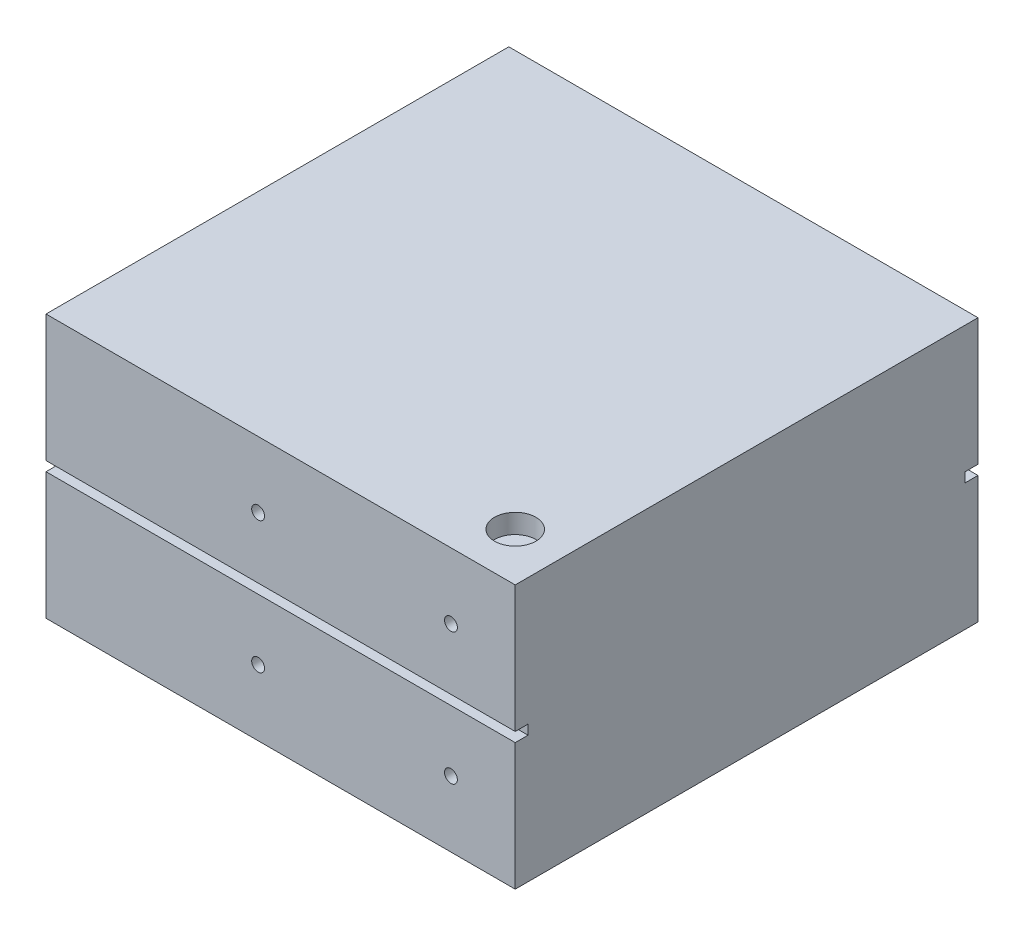
ISO-10303-21;
HEADER;
FILE_DESCRIPTION(('STEP AP214'),'2;1');
FILE_NAME('part.step','',(''),(''),'','','');
FILE_SCHEMA(('AUTOMOTIVE_DESIGN { 1 0 10303 214 1 1 1 1 }'));
ENDSEC;
DATA;
#1=APPLICATION_CONTEXT('core data for automotive mechanical design processes');
#2=APPLICATION_PROTOCOL_DEFINITION('international standard','automotive_design',2000,#1);
#3=PRODUCT_CONTEXT('',#1,'mechanical');
#4=PRODUCT('Part','Part','',(#3));
#5=PRODUCT_RELATED_PRODUCT_CATEGORY('part','',(#4));
#6=PRODUCT_DEFINITION_FORMATION('','',#4);
#7=PRODUCT_DEFINITION_CONTEXT('part definition',#1,'design');
#8=PRODUCT_DEFINITION('design','',#6,#7);
#9=PRODUCT_DEFINITION_SHAPE('','',#8);
#10=(LENGTH_UNIT() NAMED_UNIT(*) SI_UNIT(.MILLI.,.METRE.));
#11=(NAMED_UNIT(*) PLANE_ANGLE_UNIT() SI_UNIT($,.RADIAN.));
#12=(NAMED_UNIT(*) SI_UNIT($,.STERADIAN.) SOLID_ANGLE_UNIT());
#13=UNCERTAINTY_MEASURE_WITH_UNIT(LENGTH_MEASURE(1.E-05),#10,'distance_accuracy_value','');
#14=(GEOMETRIC_REPRESENTATION_CONTEXT(3) GLOBAL_UNCERTAINTY_ASSIGNED_CONTEXT((#13)) GLOBAL_UNIT_ASSIGNED_CONTEXT((#10,
#11,#12)) REPRESENTATION_CONTEXT('',''));
#15=CARTESIAN_POINT('',(0.,0.,0.));
#16=DIRECTION('',(0.,0.,1.));
#17=DIRECTION('',(1.,0.,0.));
#18=AXIS2_PLACEMENT_3D('',#15,#16,#17);
#19=CARTESIAN_POINT('',(-56.6030769230769,82.,107.163076923077));
#20=DIRECTION('',(0.,0.,-1.));
#21=DIRECTION('',(-1.,0.,0.));
#22=AXIS2_PLACEMENT_3D('',#19,#20,#21);
#23=PLANE('',#22);
#24=CARTESIAN_POINT('',(69.3969230769231,20.5,107.163076923077));
#25=DIRECTION('',(0.,0.,1.));
#26=DIRECTION('',(1.,0.,0.));
#27=AXIS2_PLACEMENT_3D('',#24,#25,#26);
#28=CIRCLE('',#27,2.);
#29=CARTESIAN_POINT('',(71.3969230769231,20.5,107.163076923077));
#30=VERTEX_POINT('',#29);
#31=EDGE_CURVE('E446',#30,#30,#28,.T.);
#32=ORIENTED_EDGE('',*,*,#31,.F.);
#33=EDGE_LOOP('',(#32));
#34=FACE_BOUND('',#33,.T.);
#35=CARTESIAN_POINT('',(9.39692307692308,20.5,107.163076923077));
#36=DIRECTION('',(0.,0.,1.));
#37=DIRECTION('',(1.,0.,0.));
#38=AXIS2_PLACEMENT_3D('',#35,#36,#37);
#39=CIRCLE('',#38,2.);
#40=CARTESIAN_POINT('',(11.3969230769231,20.5,107.163076923077));
#41=VERTEX_POINT('',#40);
#42=EDGE_CURVE('E458',#41,#41,#39,.T.);
#43=ORIENTED_EDGE('',*,*,#42,.F.);
#44=EDGE_LOOP('',(#43));
#45=FACE_BOUND('',#44,.T.);
#46=DIRECTION('',(0.,-1.,0.));
#47=VECTOR('',#46,1.);
#48=CARTESIAN_POINT('',(89.3969230769231,82.,107.163076923077));
#49=LINE('',#48,#47);
#50=CARTESIAN_POINT('',(89.3969230769231,39.5,107.163076923077));
#51=VERTEX_POINT('',#50);
#52=CARTESIAN_POINT('',(89.3969230769231,0.,107.163076923077));
#53=VERTEX_POINT('',#52);
#54=EDGE_CURVE('E251',#51,#53,#49,.T.);
#55=ORIENTED_EDGE('',*,*,#54,.F.);
#56=DIRECTION('',(-1.,0.,0.));
#57=VECTOR('',#56,1.);
#58=CARTESIAN_POINT('',(89.3969230769231,39.5,107.163076923077));
#59=LINE('',#58,#57);
#60=CARTESIAN_POINT('',(-56.6030769230769,39.5,107.163076923077));
#61=VERTEX_POINT('',#60);
#62=EDGE_CURVE('E178',#51,#61,#59,.T.);
#63=ORIENTED_EDGE('',*,*,#62,.T.);
#64=DIRECTION('',(0.,-1.,0.));
#65=VECTOR('',#64,1.);
#66=CARTESIAN_POINT('',(-56.6030769230769,82.,107.163076923077));
#67=LINE('',#66,#65);
#68=CARTESIAN_POINT('',(-56.6030769230769,0.,107.163076923077));
#69=VERTEX_POINT('',#68);
#70=EDGE_CURVE('E255',#61,#69,#67,.T.);
#71=ORIENTED_EDGE('',*,*,#70,.T.);
#72=DIRECTION('',(1.,0.,0.));
#73=VECTOR('',#72,1.);
#74=CARTESIAN_POINT('',(-56.6030769230769,0.,107.163076923077));
#75=LINE('',#74,#73);
#76=EDGE_CURVE('E238',#69,#53,#75,.T.);
#77=ORIENTED_EDGE('',*,*,#76,.T.);
#78=EDGE_LOOP('',(#55,#63,#71,#77));
#79=FACE_BOUND('',#78,.T.);
#80=ADVANCED_FACE('F33',(#34,#45,#79),#23,.F.);
#81=CARTESIAN_POINT('',(-56.6030769230769,82.,-36.8369230769231));
#82=DIRECTION('',(0.,0.,1.));
#83=DIRECTION('',(1.,0.,0.));
#84=AXIS2_PLACEMENT_3D('',#81,#82,#83);
#85=PLANE('',#84);
#86=CARTESIAN_POINT('',(69.3969230769231,61.5,-36.8369230769231));
#87=DIRECTION('',(0.,0.,-1.));
#88=DIRECTION('',(-1.,0.,0.));
#89=AXIS2_PLACEMENT_3D('',#86,#87,#88);
#90=CIRCLE('',#89,2.);
#91=CARTESIAN_POINT('',(67.3969230769231,61.5,-36.8369230769231));
#92=VERTEX_POINT('',#91);
#93=EDGE_CURVE('E436',#92,#92,#90,.T.);
#94=ORIENTED_EDGE('',*,*,#93,.F.);
#95=EDGE_LOOP('',(#94));
#96=FACE_BOUND('',#95,.T.);
#97=CARTESIAN_POINT('',(9.39692307692308,61.5,-36.8369230769231));
#98=DIRECTION('',(0.,0.,-1.));
#99=DIRECTION('',(-1.,0.,0.));
#100=AXIS2_PLACEMENT_3D('',#97,#98,#99);
#101=CIRCLE('',#100,2.);
#102=CARTESIAN_POINT('',(7.39692307692308,61.5,-36.8369230769231));
#103=VERTEX_POINT('',#102);
#104=EDGE_CURVE('E447',#103,#103,#101,.T.);
#105=ORIENTED_EDGE('',*,*,#104,.F.);
#106=EDGE_LOOP('',(#105));
#107=FACE_BOUND('',#106,.T.);
#108=DIRECTION('',(0.,-1.,0.));
#109=VECTOR('',#108,1.);
#110=CARTESIAN_POINT('',(89.3969230769231,82.,-36.8369230769231));
#111=LINE('',#110,#109);
#112=CARTESIAN_POINT('',(89.3969230769231,82.,-36.8369230769231));
#113=VERTEX_POINT('',#112);
#114=CARTESIAN_POINT('',(89.3969230769231,42.5,-36.8369230769231));
#115=VERTEX_POINT('',#114);
#116=EDGE_CURVE('E248',#113,#115,#111,.T.);
#117=ORIENTED_EDGE('',*,*,#116,.T.);
#118=DIRECTION('',(-1.,0.,0.));
#119=VECTOR('',#118,1.);
#120=CARTESIAN_POINT('',(89.3969230769231,42.5,-36.8369230769231));
#121=LINE('',#120,#119);
#122=CARTESIAN_POINT('',(-56.6030769230769,42.5,-36.8369230769231));
#123=VERTEX_POINT('',#122);
#124=EDGE_CURVE('E180',#115,#123,#121,.T.);
#125=ORIENTED_EDGE('',*,*,#124,.T.);
#126=DIRECTION('',(0.,-1.,0.));
#127=VECTOR('',#126,1.);
#128=CARTESIAN_POINT('',(-56.6030769230769,82.,-36.8369230769231));
#129=LINE('',#128,#127);
#130=CARTESIAN_POINT('',(-56.6030769230769,82.,-36.8369230769231));
#131=VERTEX_POINT('',#130);
#132=EDGE_CURVE('E245',#131,#123,#129,.T.);
#133=ORIENTED_EDGE('',*,*,#132,.F.);
#134=DIRECTION('',(-1.,0.,0.));
#135=VECTOR('',#134,1.);
#136=CARTESIAN_POINT('',(-56.6030769230769,82.,-36.8369230769231));
#137=LINE('',#136,#135);
#138=EDGE_CURVE('E232',#113,#131,#137,.T.);
#139=ORIENTED_EDGE('',*,*,#138,.F.);
#140=EDGE_LOOP('',(#117,#125,#133,#139));
#141=FACE_BOUND('',#140,.T.);
#142=ADVANCED_FACE('F315',(#96,#107,#141),#85,.F.);
#143=CARTESIAN_POINT('',(-50.6030769230769,82.,-36.8369230769231));
#144=DIRECTION('',(1.,0.,0.));
#145=DIRECTION('',(0.,0.,-1.));
#146=AXIS2_PLACEMENT_3D('',#143,#144,#145);
#147=PLANE('',#146);
#148=DIRECTION('',(0.,0.,1.));
#149=VECTOR('',#148,1.);
#150=CARTESIAN_POINT('',(-50.6030769230769,6.00000000000001,-36.8369230769231));
#151=LINE('',#150,#149);
#152=CARTESIAN_POINT('',(-50.6030769230769,6.,-30.8369230769231));
#153=VERTEX_POINT('',#152);
#154=CARTESIAN_POINT('',(-50.6030769230769,6.,101.163076923077));
#155=VERTEX_POINT('',#154);
#156=EDGE_CURVE('E258',#153,#155,#151,.T.);
#157=ORIENTED_EDGE('',*,*,#156,.F.);
#158=DIRECTION('',(0.,-1.,0.));
#159=VECTOR('',#158,1.);
#160=CARTESIAN_POINT('',(-50.6030769230769,82.,-30.8369230769231));
#161=LINE('',#160,#159);
#162=CARTESIAN_POINT('',(-50.6030769230769,76.,-30.8369230769231));
#163=VERTEX_POINT('',#162);
#164=EDGE_CURVE('E281',#163,#153,#161,.T.);
#165=ORIENTED_EDGE('',*,*,#164,.F.);
#166=DIRECTION('',(0.,0.,1.));
#167=VECTOR('',#166,1.);
#168=CARTESIAN_POINT('',(-50.6030769230769,76.,-36.8369230769231));
#169=LINE('',#168,#167);
#170=CARTESIAN_POINT('',(-50.6030769230769,76.,101.163076923077));
#171=VERTEX_POINT('',#170);
#172=EDGE_CURVE('E263',#163,#171,#169,.T.);
#173=ORIENTED_EDGE('',*,*,#172,.T.);
#174=DIRECTION('',(0.,-1.,0.));
#175=VECTOR('',#174,1.);
#176=CARTESIAN_POINT('',(-50.6030769230769,82.,101.163076923077));
#177=LINE('',#176,#175);
#178=EDGE_CURVE('E276',#171,#155,#177,.T.);
#179=ORIENTED_EDGE('',*,*,#178,.T.);
#180=EDGE_LOOP('',(#157,#165,#173,#179));
#181=FACE_BOUND('',#180,.T.);
#182=ADVANCED_FACE('F289',(#181),#147,.T.);
#183=CARTESIAN_POINT('',(-56.6030769230769,82.,101.163076923077));
#184=DIRECTION('',(0.,0.,-1.));
#185=DIRECTION('',(-1.,0.,0.));
#186=AXIS2_PLACEMENT_3D('',#183,#184,#185);
#187=PLANE('',#186);
#188=DIRECTION('',(1.,0.,0.));
#189=VECTOR('',#188,1.);
#190=CARTESIAN_POINT('',(-56.6030769230769,6.00000000000001,101.163076923077));
#191=LINE('',#190,#189);
#192=CARTESIAN_POINT('',(83.3969230769231,6.,101.163076923077));
#193=VERTEX_POINT('',#192);
#194=EDGE_CURVE('E279',#155,#193,#191,.T.);
#195=ORIENTED_EDGE('',*,*,#194,.F.);
#196=ORIENTED_EDGE('',*,*,#178,.F.);
#197=DIRECTION('',(1.,0.,0.));
#198=VECTOR('',#197,1.);
#199=CARTESIAN_POINT('',(-56.6030769230769,76.,101.163076923077));
#200=LINE('',#199,#198);
#201=CARTESIAN_POINT('',(83.3969230769231,76.,101.163076923077));
#202=VERTEX_POINT('',#201);
#203=EDGE_CURVE('E261',#171,#202,#200,.T.);
#204=ORIENTED_EDGE('',*,*,#203,.T.);
#205=DIRECTION('',(0.,-1.,0.));
#206=VECTOR('',#205,1.);
#207=CARTESIAN_POINT('',(83.3969230769231,82.,101.163076923077));
#208=LINE('',#207,#206);
#209=EDGE_CURVE('E271',#202,#193,#208,.T.);
#210=ORIENTED_EDGE('',*,*,#209,.T.);
#211=EDGE_LOOP('',(#195,#196,#204,#210));
#212=FACE_BOUND('',#211,.T.);
#213=ADVANCED_FACE('F293',(#212),#187,.T.);
#214=CARTESIAN_POINT('',(83.396923076923,82.,-36.8369230769231));
#215=DIRECTION('',(-1.,0.,0.));
#216=DIRECTION('',(0.,0.,1.));
#217=AXIS2_PLACEMENT_3D('',#214,#215,#216);
#218=PLANE('',#217);
#219=DIRECTION('',(0.,0.,-1.));
#220=VECTOR('',#219,1.);
#221=CARTESIAN_POINT('',(83.396923076923,6.00000000000001,-36.8369230769231));
#222=LINE('',#221,#220);
#223=CARTESIAN_POINT('',(83.396923076923,6.,-30.8369230769231));
#224=VERTEX_POINT('',#223);
#225=EDGE_CURVE('E274',#193,#224,#222,.T.);
#226=ORIENTED_EDGE('',*,*,#225,.F.);
#227=ORIENTED_EDGE('',*,*,#209,.F.);
#228=DIRECTION('',(0.,0.,-1.));
#229=VECTOR('',#228,1.);
#230=CARTESIAN_POINT('',(83.396923076923,76.,-36.8369230769231));
#231=LINE('',#230,#229);
#232=CARTESIAN_POINT('',(83.396923076923,76.,-30.8369230769231));
#233=VERTEX_POINT('',#232);
#234=EDGE_CURVE('E42',#202,#233,#231,.T.);
#235=ORIENTED_EDGE('',*,*,#234,.T.);
#236=DIRECTION('',(0.,-1.,0.));
#237=VECTOR('',#236,1.);
#238=CARTESIAN_POINT('',(83.396923076923,82.,-30.8369230769231));
#239=LINE('',#238,#237);
#240=EDGE_CURVE('E266',#233,#224,#239,.T.);
#241=ORIENTED_EDGE('',*,*,#240,.T.);
#242=EDGE_LOOP('',(#226,#227,#235,#241));
#243=FACE_BOUND('',#242,.T.);
#244=ADVANCED_FACE('F298',(#243),#218,.T.);
#245=CARTESIAN_POINT('',(-56.6030769230769,82.,-30.8369230769231));
#246=DIRECTION('',(0.,0.,1.));
#247=DIRECTION('',(1.,0.,0.));
#248=AXIS2_PLACEMENT_3D('',#245,#246,#247);
#249=PLANE('',#248);
#250=DIRECTION('',(-1.,0.,0.));
#251=VECTOR('',#250,1.);
#252=CARTESIAN_POINT('',(-56.6030769230769,6.00000000000001,-30.8369230769231));
#253=LINE('',#252,#251);
#254=EDGE_CURVE('E269',#224,#153,#253,.T.);
#255=ORIENTED_EDGE('',*,*,#254,.F.);
#256=ORIENTED_EDGE('',*,*,#240,.F.);
#257=DIRECTION('',(-1.,0.,0.));
#258=VECTOR('',#257,1.);
#259=CARTESIAN_POINT('',(-56.6030769230769,76.,-30.8369230769231));
#260=LINE('',#259,#258);
#261=EDGE_CURVE('E11',#233,#163,#260,.T.);
#262=ORIENTED_EDGE('',*,*,#261,.T.);
#263=ORIENTED_EDGE('',*,*,#164,.T.);
#264=EDGE_LOOP('',(#255,#256,#262,#263));
#265=FACE_BOUND('',#264,.T.);
#266=ADVANCED_FACE('F302',(#265),#249,.T.);
#267=CARTESIAN_POINT('',(0.,76.,0.));
#268=DIRECTION('',(0.,1.,0.));
#269=DIRECTION('',(0.,0.,1.));
#270=AXIS2_PLACEMENT_3D('',#267,#268,#269);
#271=PLANE('',#270);
#272=CARTESIAN_POINT('',(74.3969230769231,76.,92.1630769230769));
#273=DIRECTION('',(0.,1.,0.));
#274=DIRECTION('',(0.,0.,1.));
#275=AXIS2_PLACEMENT_3D('',#272,#273,#274);
#276=CIRCLE('',#275,6.45);
#277=CARTESIAN_POINT('',(74.3969230769231,76.,98.6130769230769));
#278=VERTEX_POINT('',#277);
#279=EDGE_CURVE('E37',#278,#278,#276,.T.);
#280=ORIENTED_EDGE('',*,*,#279,.T.);
#281=EDGE_LOOP('',(#280));
#282=FACE_BOUND('',#281,.T.);
#283=ORIENTED_EDGE('',*,*,#172,.F.);
#284=ORIENTED_EDGE('',*,*,#261,.F.);
#285=ORIENTED_EDGE('',*,*,#234,.F.);
#286=ORIENTED_EDGE('',*,*,#203,.F.);
#287=EDGE_LOOP('',(#283,#284,#285,#286));
#288=FACE_BOUND('',#287,.T.);
#289=ADVANCED_FACE('F304',(#282,#288),#271,.F.);
#290=CARTESIAN_POINT('',(0.,6.,0.));
#291=DIRECTION('',(0.,1.,0.));
#292=DIRECTION('',(0.,0.,1.));
#293=AXIS2_PLACEMENT_3D('',#290,#291,#292);
#294=PLANE('',#293);
#295=ORIENTED_EDGE('',*,*,#156,.T.);
#296=ORIENTED_EDGE('',*,*,#194,.T.);
#297=ORIENTED_EDGE('',*,*,#225,.T.);
#298=ORIENTED_EDGE('',*,*,#254,.T.);
#299=EDGE_LOOP('',(#295,#296,#297,#298));
#300=FACE_BOUND('',#299,.T.);
#301=ADVANCED_FACE('F35',(#300),#294,.T.);
#302=CARTESIAN_POINT('',(74.3969230769231,72.,92.1630769230769));
#303=DIRECTION('',(0.,1.,0.));
#304=DIRECTION('',(0.,0.,1.));
#305=AXIS2_PLACEMENT_3D('',#302,#303,#304);
#306=CYLINDRICAL_SURFACE('',#305,6.45);
#307=CARTESIAN_POINT('',(74.3969230769231,82.,92.1630769230769));
#308=DIRECTION('',(0.,1.,0.));
#309=DIRECTION('',(0.,0.,1.));
#310=AXIS2_PLACEMENT_3D('',#307,#308,#309);
#311=CIRCLE('',#310,6.45);
#312=CARTESIAN_POINT('',(74.3969230769231,82.,98.6130769230769));
#313=VERTEX_POINT('',#312);
#314=EDGE_CURVE('E213',#313,#313,#311,.T.);
#315=ORIENTED_EDGE('',*,*,#314,.T.);
#316=EDGE_LOOP('',(#315));
#317=FACE_BOUND('',#316,.T.);
#318=ORIENTED_EDGE('',*,*,#279,.F.);
#319=EDGE_LOOP('',(#318));
#320=FACE_BOUND('',#319,.T.);
#321=ADVANCED_FACE('F311',(#317,#320),#306,.F.);
#322=CARTESIAN_POINT('',(-56.6030769230769,82.,-36.8369230769231));
#323=DIRECTION('',(1.,0.,0.));
#324=DIRECTION('',(0.,0.,-1.));
#325=AXIS2_PLACEMENT_3D('',#322,#323,#324);
#326=PLANE('',#325);
#327=CARTESIAN_POINT('',(-56.6030769230769,62.,87.1630769230769));
#328=DIRECTION('',(-1.,0.,0.));
#329=DIRECTION('',(0.,0.,1.));
#330=AXIS2_PLACEMENT_3D('',#327,#328,#329);
#331=CIRCLE('',#330,6.5);
#332=CARTESIAN_POINT('',(-56.6030769230769,62.,93.6630769230769));
#333=VERTEX_POINT('',#332);
#334=EDGE_CURVE('E214',#333,#333,#331,.T.);
#335=ORIENTED_EDGE('',*,*,#334,.F.);
#336=EDGE_LOOP('',(#335));
#337=FACE_BOUND('',#336,.T.);
#338=CARTESIAN_POINT('',(-56.6030769230769,20.,-16.8369230769231));
#339=DIRECTION('',(-1.,0.,0.));
#340=DIRECTION('',(0.,0.,1.));
#341=AXIS2_PLACEMENT_3D('',#338,#339,#340);
#342=CIRCLE('',#341,6.50000000000001);
#343=CARTESIAN_POINT('',(-56.6030769230769,20.,-10.3369230769231));
#344=VERTEX_POINT('',#343);
#345=EDGE_CURVE('E183',#344,#344,#342,.T.);
#346=ORIENTED_EDGE('',*,*,#345,.F.);
#347=EDGE_LOOP('',(#346));
#348=FACE_BOUND('',#347,.T.);
#349=ORIENTED_EDGE('',*,*,#132,.T.);
#350=DIRECTION('',(0.,0.,-1.));
#351=VECTOR('',#350,1.);
#352=CARTESIAN_POINT('',(-56.6030769230769,42.5,-36.8369230769231));
#353=LINE('',#352,#351);
#354=CARTESIAN_POINT('',(-56.6030769230769,42.5,-32.8369230769231));
#355=VERTEX_POINT('',#354);
#356=EDGE_CURVE('E168',#355,#123,#353,.T.);
#357=ORIENTED_EDGE('',*,*,#356,.F.);
#358=DIRECTION('',(0.,1.,0.));
#359=VECTOR('',#358,1.);
#360=CARTESIAN_POINT('',(-56.6030769230769,42.5,-32.8369230769231));
#361=LINE('',#360,#359);
#362=CARTESIAN_POINT('',(-56.6030769230769,39.5,-32.8369230769231));
#363=VERTEX_POINT('',#362);
#364=EDGE_CURVE('E170',#363,#355,#361,.T.);
#365=ORIENTED_EDGE('',*,*,#364,.F.);
#366=DIRECTION('',(0.,0.,1.));
#367=VECTOR('',#366,1.);
#368=CARTESIAN_POINT('',(-56.6030769230769,39.5,-36.8369230769231));
#369=LINE('',#368,#367);
#370=CARTESIAN_POINT('',(-56.6030769230769,39.5,-36.8369230769231));
#371=VERTEX_POINT('',#370);
#372=EDGE_CURVE('E149',#371,#363,#369,.T.);
#373=ORIENTED_EDGE('',*,*,#372,.F.);
#374=CARTESIAN_POINT('',(-56.6030769230769,0.,-36.8369230769231));
#375=VERTEX_POINT('',#374);
#376=EDGE_CURVE('E234',#371,#375,#129,.T.);
#377=ORIENTED_EDGE('',*,*,#376,.T.);
#378=DIRECTION('',(0.,0.,1.));
#379=VECTOR('',#378,1.);
#380=CARTESIAN_POINT('',(-56.6030769230769,0.,-36.8369230769231));
#381=LINE('',#380,#379);
#382=EDGE_CURVE('E235',#375,#69,#381,.T.);
#383=ORIENTED_EDGE('',*,*,#382,.T.);
#384=ORIENTED_EDGE('',*,*,#70,.F.);
#385=DIRECTION('',(0.,0.,1.));
#386=VECTOR('',#385,1.);
#387=CARTESIAN_POINT('',(-56.6030769230769,39.5,107.163076923077));
#388=LINE('',#387,#386);
#389=CARTESIAN_POINT('',(-56.6030769230769,39.5,103.163076923077));
#390=VERTEX_POINT('',#389);
#391=EDGE_CURVE('E189',#390,#61,#388,.T.);
#392=ORIENTED_EDGE('',*,*,#391,.F.);
#393=DIRECTION('',(0.,-1.,0.));
#394=VECTOR('',#393,1.);
#395=CARTESIAN_POINT('',(-56.6030769230769,42.5,103.163076923077));
#396=LINE('',#395,#394);
#397=CARTESIAN_POINT('',(-56.6030769230769,42.5,103.163076923077));
#398=VERTEX_POINT('',#397);
#399=EDGE_CURVE('E198',#398,#390,#396,.T.);
#400=ORIENTED_EDGE('',*,*,#399,.F.);
#401=DIRECTION('',(0.,0.,-1.));
#402=VECTOR('',#401,1.);
#403=CARTESIAN_POINT('',(-56.6030769230769,42.5,107.163076923077));
#404=LINE('',#403,#402);
#405=CARTESIAN_POINT('',(-56.6030769230769,42.5,107.163076923077));
#406=VERTEX_POINT('',#405);
#407=EDGE_CURVE('E195',#406,#398,#404,.T.);
#408=ORIENTED_EDGE('',*,*,#407,.F.);
#409=CARTESIAN_POINT('',(-56.6030769230769,82.,107.163076923077));
#410=VERTEX_POINT('',#409);
#411=EDGE_CURVE('E256',#410,#406,#67,.T.);
#412=ORIENTED_EDGE('',*,*,#411,.F.);
#413=DIRECTION('',(0.,0.,1.));
#414=VECTOR('',#413,1.);
#415=CARTESIAN_POINT('',(-56.6030769230769,82.,-36.8369230769231));
#416=LINE('',#415,#414);
#417=EDGE_CURVE('E224',#131,#410,#416,.T.);
#418=ORIENTED_EDGE('',*,*,#417,.F.);
#419=EDGE_LOOP('',(#349,#357,#365,#373,#377,#383,#384,#392,#400,#408,#412,#418));
#420=FACE_BOUND('',#419,.T.);
#421=ADVANCED_FACE('F330',(#337,#348,#420),#326,.F.);
#422=CARTESIAN_POINT('',(9.39692307692308,61.5,107.163076923077));
#423=DIRECTION('',(0.,0.,1.));
#424=DIRECTION('',(1.,0.,0.));
#425=AXIS2_PLACEMENT_3D('',#422,#423,#424);
#426=CIRCLE('',#425,2.);
#427=CARTESIAN_POINT('',(11.3969230769231,61.5,107.163076923077));
#428=VERTEX_POINT('',#427);
#429=EDGE_CURVE('E340',#428,#428,#426,.T.);
#430=ORIENTED_EDGE('',*,*,#429,.F.);
#431=EDGE_LOOP('',(#430));
#432=FACE_BOUND('',#431,.T.);
#433=CARTESIAN_POINT('',(69.3969230769231,61.5,107.163076923077));
#434=DIRECTION('',(0.,0.,1.));
#435=DIRECTION('',(1.,0.,0.));
#436=AXIS2_PLACEMENT_3D('',#433,#434,#435);
#437=CIRCLE('',#436,2.);
#438=CARTESIAN_POINT('',(71.3969230769231,61.5,107.163076923077));
#439=VERTEX_POINT('',#438);
#440=EDGE_CURVE('E173',#439,#439,#437,.T.);
#441=ORIENTED_EDGE('',*,*,#440,.F.);
#442=EDGE_LOOP('',(#441));
#443=FACE_BOUND('',#442,.T.);
#444=ORIENTED_EDGE('',*,*,#411,.T.);
#445=DIRECTION('',(-1.,0.,0.));
#446=VECTOR('',#445,1.);
#447=CARTESIAN_POINT('',(89.3969230769231,42.5,107.163076923077));
#448=LINE('',#447,#446);
#449=CARTESIAN_POINT('',(89.3969230769231,42.5,107.163076923077));
#450=VERTEX_POINT('',#449);
#451=EDGE_CURVE('E194',#450,#406,#448,.T.);
#452=ORIENTED_EDGE('',*,*,#451,.F.);
#453=CARTESIAN_POINT('',(89.3969230769231,82.,107.163076923077));
#454=VERTEX_POINT('',#453);
#455=EDGE_CURVE('E252',#454,#450,#49,.T.);
#456=ORIENTED_EDGE('',*,*,#455,.F.);
#457=DIRECTION('',(1.,0.,0.));
#458=VECTOR('',#457,1.);
#459=CARTESIAN_POINT('',(-56.6030769230769,82.,107.163076923077));
#460=LINE('',#459,#458);
#461=EDGE_CURVE('E227',#410,#454,#460,.T.);
#462=ORIENTED_EDGE('',*,*,#461,.F.);
#463=EDGE_LOOP('',(#444,#452,#456,#462));
#464=FACE_BOUND('',#463,.T.);
#465=ADVANCED_FACE('F318',(#432,#443,#464),#23,.F.);
#466=CARTESIAN_POINT('',(89.3969230769231,82.,-36.8369230769231));
#467=DIRECTION('',(-1.,0.,0.));
#468=DIRECTION('',(0.,0.,1.));
#469=AXIS2_PLACEMENT_3D('',#466,#467,#468);
#470=PLANE('',#469);
#471=DIRECTION('',(0.,1.,0.));
#472=VECTOR('',#471,1.);
#473=CARTESIAN_POINT('',(89.3969230769231,42.5,-32.8369230769231));
#474=LINE('',#473,#472);
#475=CARTESIAN_POINT('',(89.3969230769231,39.5,-32.8369230769231));
#476=VERTEX_POINT('',#475);
#477=CARTESIAN_POINT('',(89.3969230769231,42.5,-32.8369230769231));
#478=VERTEX_POINT('',#477);
#479=EDGE_CURVE('E157',#476,#478,#474,.T.);
#480=ORIENTED_EDGE('',*,*,#479,.T.);
#481=DIRECTION('',(0.,0.,-1.));
#482=VECTOR('',#481,1.);
#483=CARTESIAN_POINT('',(89.3969230769231,42.5,-36.8369230769231));
#484=LINE('',#483,#482);
#485=EDGE_CURVE('E162',#478,#115,#484,.T.);
#486=ORIENTED_EDGE('',*,*,#485,.T.);
#487=ORIENTED_EDGE('',*,*,#116,.F.);
#488=DIRECTION('',(0.,0.,-1.));
#489=VECTOR('',#488,1.);
#490=CARTESIAN_POINT('',(89.3969230769231,82.,-36.8369230769231));
#491=LINE('',#490,#489);
#492=EDGE_CURVE('E230',#454,#113,#491,.T.);
#493=ORIENTED_EDGE('',*,*,#492,.F.);
#494=ORIENTED_EDGE('',*,*,#455,.T.);
#495=DIRECTION('',(0.,0.,-1.));
#496=VECTOR('',#495,1.);
#497=CARTESIAN_POINT('',(89.3969230769231,42.5,107.163076923077));
#498=LINE('',#497,#496);
#499=CARTESIAN_POINT('',(89.3969230769231,42.5,103.163076923077));
#500=VERTEX_POINT('',#499);
#501=EDGE_CURVE('E186',#450,#500,#498,.T.);
#502=ORIENTED_EDGE('',*,*,#501,.T.);
#503=DIRECTION('',(0.,-1.,0.));
#504=VECTOR('',#503,1.);
#505=CARTESIAN_POINT('',(89.3969230769231,42.5,103.163076923077));
#506=LINE('',#505,#504);
#507=CARTESIAN_POINT('',(89.3969230769231,39.5,103.163076923077));
#508=VERTEX_POINT('',#507);
#509=EDGE_CURVE('E50',#500,#508,#506,.T.);
#510=ORIENTED_EDGE('',*,*,#509,.T.);
#511=DIRECTION('',(0.,0.,1.));
#512=VECTOR('',#511,1.);
#513=CARTESIAN_POINT('',(89.3969230769231,39.5,107.163076923077));
#514=LINE('',#513,#512);
#515=EDGE_CURVE('E191',#508,#51,#514,.T.);
#516=ORIENTED_EDGE('',*,*,#515,.T.);
#517=ORIENTED_EDGE('',*,*,#54,.T.);
#518=DIRECTION('',(0.,0.,-1.));
#519=VECTOR('',#518,1.);
#520=CARTESIAN_POINT('',(89.3969230769231,0.,-36.8369230769231));
#521=LINE('',#520,#519);
#522=CARTESIAN_POINT('',(89.3969230769231,0.,-36.8369230769231));
#523=VERTEX_POINT('',#522);
#524=EDGE_CURVE('E241',#53,#523,#521,.T.);
#525=ORIENTED_EDGE('',*,*,#524,.T.);
#526=CARTESIAN_POINT('',(89.3969230769231,39.5,-36.8369230769231));
#527=VERTEX_POINT('',#526);
#528=EDGE_CURVE('E167',#527,#523,#111,.T.);
#529=ORIENTED_EDGE('',*,*,#528,.F.);
#530=DIRECTION('',(0.,0.,1.));
#531=VECTOR('',#530,1.);
#532=CARTESIAN_POINT('',(89.3969230769231,39.5,-36.8369230769231));
#533=LINE('',#532,#531);
#534=EDGE_CURVE('E58',#527,#476,#533,.T.);
#535=ORIENTED_EDGE('',*,*,#534,.T.);
#536=EDGE_LOOP('',(#480,#486,#487,#493,#494,#502,#510,#516,#517,#525,#529,#535));
#537=FACE_BOUND('',#536,.T.);
#538=ADVANCED_FACE('F165',(#537),#470,.F.);
#539=CARTESIAN_POINT('',(9.39692307692308,20.5,-36.8369230769231));
#540=DIRECTION('',(0.,0.,-1.));
#541=DIRECTION('',(-1.,0.,0.));
#542=AXIS2_PLACEMENT_3D('',#539,#540,#541);
#543=CIRCLE('',#542,2.);
#544=CARTESIAN_POINT('',(7.39692307692308,20.5,-36.8369230769231));
#545=VERTEX_POINT('',#544);
#546=EDGE_CURVE('E417',#545,#545,#543,.T.);
#547=ORIENTED_EDGE('',*,*,#546,.F.);
#548=EDGE_LOOP('',(#547));
#549=FACE_BOUND('',#548,.T.);
#550=CARTESIAN_POINT('',(69.3969230769231,20.5,-36.8369230769231));
#551=DIRECTION('',(0.,0.,-1.));
#552=DIRECTION('',(-1.,0.,0.));
#553=AXIS2_PLACEMENT_3D('',#550,#551,#552);
#554=CIRCLE('',#553,2.);
#555=CARTESIAN_POINT('',(67.3969230769231,20.5,-36.8369230769231));
#556=VERTEX_POINT('',#555);
#557=EDGE_CURVE('E421',#556,#556,#554,.T.);
#558=ORIENTED_EDGE('',*,*,#557,.F.);
#559=EDGE_LOOP('',(#558));
#560=FACE_BOUND('',#559,.T.);
#561=ORIENTED_EDGE('',*,*,#376,.F.);
#562=DIRECTION('',(-1.,0.,0.));
#563=VECTOR('',#562,1.);
#564=CARTESIAN_POINT('',(89.3969230769231,39.5,-36.8369230769231));
#565=LINE('',#564,#563);
#566=EDGE_CURVE('E154',#527,#371,#565,.T.);
#567=ORIENTED_EDGE('',*,*,#566,.F.);
#568=ORIENTED_EDGE('',*,*,#528,.T.);
#569=DIRECTION('',(-1.,0.,0.));
#570=VECTOR('',#569,1.);
#571=CARTESIAN_POINT('',(-56.6030769230769,0.,-36.8369230769231));
#572=LINE('',#571,#570);
#573=EDGE_CURVE('E228',#523,#375,#572,.T.);
#574=ORIENTED_EDGE('',*,*,#573,.T.);
#575=EDGE_LOOP('',(#561,#567,#568,#574));
#576=FACE_BOUND('',#575,.T.);
#577=ADVANCED_FACE('F324',(#549,#560,#576),#85,.F.);
#578=CARTESIAN_POINT('',(0.,82.,0.));
#579=DIRECTION('',(0.,1.,0.));
#580=DIRECTION('',(0.,0.,1.));
#581=AXIS2_PLACEMENT_3D('',#578,#579,#580);
#582=PLANE('',#581);
#583=ORIENTED_EDGE('',*,*,#314,.F.);
#584=EDGE_LOOP('',(#583));
#585=FACE_BOUND('',#584,.T.);
#586=ORIENTED_EDGE('',*,*,#417,.T.);
#587=ORIENTED_EDGE('',*,*,#461,.T.);
#588=ORIENTED_EDGE('',*,*,#492,.T.);
#589=ORIENTED_EDGE('',*,*,#138,.T.);
#590=EDGE_LOOP('',(#586,#587,#588,#589));
#591=FACE_BOUND('',#590,.T.);
#592=ADVANCED_FACE('F358',(#585,#591),#582,.T.);
#593=CARTESIAN_POINT('',(0.,0.,0.));
#594=DIRECTION('',(0.,1.,0.));
#595=DIRECTION('',(0.,0.,1.));
#596=AXIS2_PLACEMENT_3D('',#593,#594,#595);
#597=PLANE('',#596);
#598=ORIENTED_EDGE('',*,*,#382,.F.);
#599=ORIENTED_EDGE('',*,*,#573,.F.);
#600=ORIENTED_EDGE('',*,*,#524,.F.);
#601=ORIENTED_EDGE('',*,*,#76,.F.);
#602=EDGE_LOOP('',(#598,#599,#600,#601));
#603=FACE_BOUND('',#602,.T.);
#604=ADVANCED_FACE('F400',(#603),#597,.F.);
#605=CARTESIAN_POINT('',(-51.6030769230769,20.,-16.8369230769231));
#606=DIRECTION('',(-1.,0.,0.));
#607=DIRECTION('',(0.,0.,1.));
#608=AXIS2_PLACEMENT_3D('',#605,#606,#607);
#609=CYLINDRICAL_SURFACE('',#608,6.50000000000001);
#610=CARTESIAN_POINT('',(-51.6030769230769,20.,-16.8369230769231));
#611=DIRECTION('',(-1.,0.,0.));
#612=DIRECTION('',(0.,0.,1.));
#613=AXIS2_PLACEMENT_3D('',#610,#611,#612);
#614=CIRCLE('',#613,6.50000000000001);
#615=CARTESIAN_POINT('',(-51.6030769230769,20.,-10.3369230769231));
#616=VERTEX_POINT('',#615);
#617=EDGE_CURVE('E217',#616,#616,#614,.T.);
#618=ORIENTED_EDGE('',*,*,#617,.F.);
#619=EDGE_LOOP('',(#618));
#620=FACE_BOUND('',#619,.T.);
#621=ORIENTED_EDGE('',*,*,#345,.T.);
#622=EDGE_LOOP('',(#621));
#623=FACE_BOUND('',#622,.T.);
#624=ADVANCED_FACE('F396',(#620,#623),#609,.F.);
#625=CARTESIAN_POINT('',(-51.6030769230769,20.,-16.8369230769231));
#626=DIRECTION('',(-1.,0.,0.));
#627=DIRECTION('',(0.,0.,1.));
#628=AXIS2_PLACEMENT_3D('',#625,#626,#627);
#629=PLANE('',#628);
#630=ORIENTED_EDGE('',*,*,#617,.T.);
#631=EDGE_LOOP('',(#630));
#632=FACE_BOUND('',#631,.T.);
#633=ADVANCED_FACE('F392',(#632),#629,.T.);
#634=CARTESIAN_POINT('',(-51.6030769230769,62.,87.1630769230769));
#635=DIRECTION('',(-1.,0.,0.));
#636=DIRECTION('',(0.,0.,1.));
#637=AXIS2_PLACEMENT_3D('',#634,#635,#636);
#638=CYLINDRICAL_SURFACE('',#637,6.5);
#639=CARTESIAN_POINT('',(-51.6030769230769,62.,87.1630769230769));
#640=DIRECTION('',(-1.,0.,0.));
#641=DIRECTION('',(0.,0.,1.));
#642=AXIS2_PLACEMENT_3D('',#639,#640,#641);
#643=CIRCLE('',#642,6.5);
#644=CARTESIAN_POINT('',(-51.6030769230769,62.,93.6630769230769));
#645=VERTEX_POINT('',#644);
#646=EDGE_CURVE('E210',#645,#645,#643,.T.);
#647=ORIENTED_EDGE('',*,*,#646,.F.);
#648=EDGE_LOOP('',(#647));
#649=FACE_BOUND('',#648,.T.);
#650=ORIENTED_EDGE('',*,*,#334,.T.);
#651=EDGE_LOOP('',(#650));
#652=FACE_BOUND('',#651,.T.);
#653=ADVANCED_FACE('F372',(#649,#652),#638,.F.);
#654=CARTESIAN_POINT('',(-51.6030769230769,62.,87.1630769230769));
#655=DIRECTION('',(-1.,0.,0.));
#656=DIRECTION('',(0.,0.,1.));
#657=AXIS2_PLACEMENT_3D('',#654,#655,#656);
#658=PLANE('',#657);
#659=ORIENTED_EDGE('',*,*,#646,.T.);
#660=EDGE_LOOP('',(#659));
#661=FACE_BOUND('',#660,.T.);
#662=ADVANCED_FACE('F365',(#661),#658,.T.);
#663=CARTESIAN_POINT('',(89.3969230769231,42.5,-36.8369230769231));
#664=DIRECTION('',(0.,1.,0.));
#665=DIRECTION('',(0.,0.,1.));
#666=AXIS2_PLACEMENT_3D('',#663,#664,#665);
#667=PLANE('',#666);
#668=ORIENTED_EDGE('',*,*,#356,.T.);
#669=ORIENTED_EDGE('',*,*,#124,.F.);
#670=ORIENTED_EDGE('',*,*,#485,.F.);
#671=DIRECTION('',(-1.,0.,0.));
#672=VECTOR('',#671,1.);
#673=CARTESIAN_POINT('',(89.3969230769231,42.5,-32.8369230769231));
#674=LINE('',#673,#672);
#675=EDGE_CURVE('E153',#478,#355,#674,.T.);
#676=ORIENTED_EDGE('',*,*,#675,.T.);
#677=EDGE_LOOP('',(#668,#669,#670,#676));
#678=FACE_BOUND('',#677,.T.);
#679=ADVANCED_FACE('F363',(#678),#667,.F.);
#680=CARTESIAN_POINT('',(89.3969230769231,42.5,-32.8369230769231));
#681=DIRECTION('',(0.,0.,1.));
#682=DIRECTION('',(1.,0.,0.));
#683=AXIS2_PLACEMENT_3D('',#680,#681,#682);
#684=PLANE('',#683);
#685=ORIENTED_EDGE('',*,*,#364,.T.);
#686=ORIENTED_EDGE('',*,*,#675,.F.);
#687=ORIENTED_EDGE('',*,*,#479,.F.);
#688=DIRECTION('',(-1.,0.,0.));
#689=VECTOR('',#688,1.);
#690=CARTESIAN_POINT('',(89.3969230769231,39.5,-32.8369230769231));
#691=LINE('',#690,#689);
#692=EDGE_CURVE('E145',#476,#363,#691,.T.);
#693=ORIENTED_EDGE('',*,*,#692,.T.);
#694=EDGE_LOOP('',(#685,#686,#687,#693));
#695=FACE_BOUND('',#694,.T.);
#696=ADVANCED_FACE('F158',(#695),#684,.F.);
#697=CARTESIAN_POINT('',(89.3969230769231,39.5,-36.8369230769231));
#698=DIRECTION('',(0.,-1.,0.));
#699=DIRECTION('',(0.,0.,-1.));
#700=AXIS2_PLACEMENT_3D('',#697,#698,#699);
#701=PLANE('',#700);
#702=ORIENTED_EDGE('',*,*,#372,.T.);
#703=ORIENTED_EDGE('',*,*,#692,.F.);
#704=ORIENTED_EDGE('',*,*,#534,.F.);
#705=ORIENTED_EDGE('',*,*,#566,.T.);
#706=EDGE_LOOP('',(#702,#703,#704,#705));
#707=FACE_BOUND('',#706,.T.);
#708=ADVANCED_FACE('F147',(#707),#701,.F.);
#709=CARTESIAN_POINT('',(89.3969230769231,39.5,107.163076923077));
#710=DIRECTION('',(0.,-1.,0.));
#711=DIRECTION('',(0.,0.,-1.));
#712=AXIS2_PLACEMENT_3D('',#709,#710,#711);
#713=PLANE('',#712);
#714=ORIENTED_EDGE('',*,*,#391,.T.);
#715=ORIENTED_EDGE('',*,*,#62,.F.);
#716=ORIENTED_EDGE('',*,*,#515,.F.);
#717=DIRECTION('',(-1.,0.,0.));
#718=VECTOR('',#717,1.);
#719=CARTESIAN_POINT('',(89.3969230769231,39.5,103.163076923077));
#720=LINE('',#719,#718);
#721=EDGE_CURVE('E205',#508,#390,#720,.T.);
#722=ORIENTED_EDGE('',*,*,#721,.T.);
#723=EDGE_LOOP('',(#714,#715,#716,#722));
#724=FACE_BOUND('',#723,.T.);
#725=ADVANCED_FACE('F381',(#724),#713,.F.);
#726=CARTESIAN_POINT('',(89.3969230769231,42.5,103.163076923077));
#727=DIRECTION('',(0.,0.,-1.));
#728=DIRECTION('',(-1.,0.,0.));
#729=AXIS2_PLACEMENT_3D('',#726,#727,#728);
#730=PLANE('',#729);
#731=ORIENTED_EDGE('',*,*,#399,.T.);
#732=ORIENTED_EDGE('',*,*,#721,.F.);
#733=ORIENTED_EDGE('',*,*,#509,.F.);
#734=DIRECTION('',(-1.,0.,0.));
#735=VECTOR('',#734,1.);
#736=CARTESIAN_POINT('',(89.3969230769231,42.5,103.163076923077));
#737=LINE('',#736,#735);
#738=EDGE_CURVE('E207',#500,#398,#737,.T.);
#739=ORIENTED_EDGE('',*,*,#738,.T.);
#740=EDGE_LOOP('',(#731,#732,#733,#739));
#741=FACE_BOUND('',#740,.T.);
#742=ADVANCED_FACE('F384',(#741),#730,.F.);
#743=CARTESIAN_POINT('',(89.3969230769231,42.5,107.163076923077));
#744=DIRECTION('',(0.,1.,0.));
#745=DIRECTION('',(0.,0.,1.));
#746=AXIS2_PLACEMENT_3D('',#743,#744,#745);
#747=PLANE('',#746);
#748=ORIENTED_EDGE('',*,*,#407,.T.);
#749=ORIENTED_EDGE('',*,*,#738,.F.);
#750=ORIENTED_EDGE('',*,*,#501,.F.);
#751=ORIENTED_EDGE('',*,*,#451,.T.);
#752=EDGE_LOOP('',(#748,#749,#750,#751));
#753=FACE_BOUND('',#752,.T.);
#754=ADVANCED_FACE('F353',(#753),#747,.F.);
#755=CARTESIAN_POINT('',(69.3969230769231,61.5,103.163076923077));
#756=DIRECTION('',(0.,0.,1.));
#757=DIRECTION('',(1.,0.,0.));
#758=AXIS2_PLACEMENT_3D('',#755,#756,#757);
#759=CYLINDRICAL_SURFACE('',#758,2.);
#760=CARTESIAN_POINT('',(69.3969230769231,61.5,103.163076923077));
#761=DIRECTION('',(0.,0.,1.));
#762=DIRECTION('',(1.,0.,0.));
#763=AXIS2_PLACEMENT_3D('',#760,#761,#762);
#764=CIRCLE('',#763,2.);
#765=CARTESIAN_POINT('',(71.3969230769231,61.5,103.163076923077));
#766=VERTEX_POINT('',#765);
#767=EDGE_CURVE('E199',#766,#766,#764,.T.);
#768=ORIENTED_EDGE('',*,*,#767,.F.);
#769=EDGE_LOOP('',(#768));
#770=FACE_BOUND('',#769,.T.);
#771=ORIENTED_EDGE('',*,*,#440,.T.);
#772=EDGE_LOOP('',(#771));
#773=FACE_BOUND('',#772,.T.);
#774=ADVANCED_FACE('F376',(#770,#773),#759,.F.);
#775=CARTESIAN_POINT('',(69.3969230769231,61.5,103.163076923077));
#776=DIRECTION('',(0.,0.,1.));
#777=DIRECTION('',(1.,0.,0.));
#778=AXIS2_PLACEMENT_3D('',#775,#776,#777);
#779=PLANE('',#778);
#780=ORIENTED_EDGE('',*,*,#767,.T.);
#781=EDGE_LOOP('',(#780));
#782=FACE_BOUND('',#781,.T.);
#783=ADVANCED_FACE('F470',(#782),#779,.T.);
#784=CARTESIAN_POINT('',(9.39692307692308,61.5,103.163076923077));
#785=DIRECTION('',(0.,0.,1.));
#786=DIRECTION('',(1.,0.,0.));
#787=AXIS2_PLACEMENT_3D('',#784,#785,#786);
#788=CYLINDRICAL_SURFACE('',#787,2.);
#789=CARTESIAN_POINT('',(9.39692307692308,61.5,103.163076923077));
#790=DIRECTION('',(0.,0.,1.));
#791=DIRECTION('',(1.,0.,0.));
#792=AXIS2_PLACEMENT_3D('',#789,#790,#791);
#793=CIRCLE('',#792,2.);
#794=CARTESIAN_POINT('',(11.3969230769231,61.5,103.163076923077));
#795=VERTEX_POINT('',#794);
#796=EDGE_CURVE('E451',#795,#795,#793,.T.);
#797=ORIENTED_EDGE('',*,*,#796,.F.);
#798=EDGE_LOOP('',(#797));
#799=FACE_BOUND('',#798,.T.);
#800=ORIENTED_EDGE('',*,*,#429,.T.);
#801=EDGE_LOOP('',(#800));
#802=FACE_BOUND('',#801,.T.);
#803=ADVANCED_FACE('F475',(#799,#802),#788,.F.);
#804=CARTESIAN_POINT('',(9.39692307692308,61.5,103.163076923077));
#805=DIRECTION('',(0.,0.,1.));
#806=DIRECTION('',(1.,0.,0.));
#807=AXIS2_PLACEMENT_3D('',#804,#805,#806);
#808=PLANE('',#807);
#809=ORIENTED_EDGE('',*,*,#796,.T.);
#810=EDGE_LOOP('',(#809));
#811=FACE_BOUND('',#810,.T.);
#812=ADVANCED_FACE('F479',(#811),#808,.T.);
#813=CARTESIAN_POINT('',(9.39692307692308,20.5,103.163076923077));
#814=DIRECTION('',(0.,0.,1.));
#815=DIRECTION('',(1.,0.,0.));
#816=AXIS2_PLACEMENT_3D('',#813,#814,#815);
#817=CYLINDRICAL_SURFACE('',#816,2.);
#818=CARTESIAN_POINT('',(9.39692307692308,20.5,103.163076923077));
#819=DIRECTION('',(0.,0.,1.));
#820=DIRECTION('',(1.,0.,0.));
#821=AXIS2_PLACEMENT_3D('',#818,#819,#820);
#822=CIRCLE('',#821,2.);
#823=CARTESIAN_POINT('',(11.3969230769231,20.5,103.163076923077));
#824=VERTEX_POINT('',#823);
#825=EDGE_CURVE('E455',#824,#824,#822,.T.);
#826=ORIENTED_EDGE('',*,*,#825,.F.);
#827=EDGE_LOOP('',(#826));
#828=FACE_BOUND('',#827,.T.);
#829=ORIENTED_EDGE('',*,*,#42,.T.);
#830=EDGE_LOOP('',(#829));
#831=FACE_BOUND('',#830,.T.);
#832=ADVANCED_FACE('F493',(#828,#831),#817,.F.);
#833=CARTESIAN_POINT('',(9.39692307692308,20.5,103.163076923077));
#834=DIRECTION('',(0.,0.,1.));
#835=DIRECTION('',(1.,0.,0.));
#836=AXIS2_PLACEMENT_3D('',#833,#834,#835);
#837=PLANE('',#836);
#838=ORIENTED_EDGE('',*,*,#825,.T.);
#839=EDGE_LOOP('',(#838));
#840=FACE_BOUND('',#839,.T.);
#841=ADVANCED_FACE('F487',(#840),#837,.T.);
#842=CARTESIAN_POINT('',(69.3969230769231,20.5,103.163076923077));
#843=DIRECTION('',(0.,0.,1.));
#844=DIRECTION('',(1.,0.,0.));
#845=AXIS2_PLACEMENT_3D('',#842,#843,#844);
#846=CYLINDRICAL_SURFACE('',#845,2.);
#847=CARTESIAN_POINT('',(69.3969230769231,20.5,103.163076923077));
#848=DIRECTION('',(0.,0.,1.));
#849=DIRECTION('',(1.,0.,0.));
#850=AXIS2_PLACEMENT_3D('',#847,#848,#849);
#851=CIRCLE('',#850,2.);
#852=CARTESIAN_POINT('',(71.3969230769231,20.5,103.163076923077));
#853=VERTEX_POINT('',#852);
#854=EDGE_CURVE('E461',#853,#853,#851,.T.);
#855=ORIENTED_EDGE('',*,*,#854,.F.);
#856=EDGE_LOOP('',(#855));
#857=FACE_BOUND('',#856,.T.);
#858=ORIENTED_EDGE('',*,*,#31,.T.);
#859=EDGE_LOOP('',(#858));
#860=FACE_BOUND('',#859,.T.);
#861=ADVANCED_FACE('F483',(#857,#860),#846,.F.);
#862=CARTESIAN_POINT('',(69.3969230769231,20.5,103.163076923077));
#863=DIRECTION('',(0.,0.,1.));
#864=DIRECTION('',(1.,0.,0.));
#865=AXIS2_PLACEMENT_3D('',#862,#863,#864);
#866=PLANE('',#865);
#867=ORIENTED_EDGE('',*,*,#854,.T.);
#868=EDGE_LOOP('',(#867));
#869=FACE_BOUND('',#868,.T.);
#870=ADVANCED_FACE('F486',(#869),#866,.T.);
#871=CARTESIAN_POINT('',(69.3969230769231,20.5,-32.8369230769231));
#872=DIRECTION('',(0.,0.,-1.));
#873=DIRECTION('',(-1.,0.,0.));
#874=AXIS2_PLACEMENT_3D('',#871,#872,#873);
#875=CYLINDRICAL_SURFACE('',#874,2.);
#876=CARTESIAN_POINT('',(69.3969230769231,20.5,-32.8369230769231));
#877=DIRECTION('',(0.,0.,-1.));
#878=DIRECTION('',(-1.,0.,0.));
#879=AXIS2_PLACEMENT_3D('',#876,#877,#878);
#880=CIRCLE('',#879,2.);
#881=CARTESIAN_POINT('',(67.3969230769231,20.5,-32.8369230769231));
#882=VERTEX_POINT('',#881);
#883=EDGE_CURVE('E432',#882,#882,#880,.T.);
#884=ORIENTED_EDGE('',*,*,#883,.F.);
#885=EDGE_LOOP('',(#884));
#886=FACE_BOUND('',#885,.T.);
#887=ORIENTED_EDGE('',*,*,#557,.T.);
#888=EDGE_LOOP('',(#887));
#889=FACE_BOUND('',#888,.T.);
#890=ADVANCED_FACE('F491',(#886,#889),#875,.F.);
#891=CARTESIAN_POINT('',(69.3969230769231,20.5,-32.8369230769231));
#892=DIRECTION('',(0.,0.,-1.));
#893=DIRECTION('',(-1.,0.,0.));
#894=AXIS2_PLACEMENT_3D('',#891,#892,#893);
#895=PLANE('',#894);
#896=ORIENTED_EDGE('',*,*,#883,.T.);
#897=EDGE_LOOP('',(#896));
#898=FACE_BOUND('',#897,.T.);
#899=ADVANCED_FACE('F516',(#898),#895,.T.);
#900=CARTESIAN_POINT('',(9.39692307692308,20.5,-32.8369230769231));
#901=DIRECTION('',(0.,0.,-1.));
#902=DIRECTION('',(-1.,0.,0.));
#903=AXIS2_PLACEMENT_3D('',#900,#901,#902);
#904=CYLINDRICAL_SURFACE('',#903,2.);
#905=CARTESIAN_POINT('',(9.39692307692308,20.5,-32.8369230769231));
#906=DIRECTION('',(0.,0.,-1.));
#907=DIRECTION('',(-1.,0.,0.));
#908=AXIS2_PLACEMENT_3D('',#905,#906,#907);
#909=CIRCLE('',#908,2.);
#910=CARTESIAN_POINT('',(7.39692307692308,20.5,-32.8369230769231));
#911=VERTEX_POINT('',#910);
#912=EDGE_CURVE('E433',#911,#911,#909,.T.);
#913=ORIENTED_EDGE('',*,*,#912,.F.);
#914=EDGE_LOOP('',(#913));
#915=FACE_BOUND('',#914,.T.);
#916=ORIENTED_EDGE('',*,*,#546,.T.);
#917=EDGE_LOOP('',(#916));
#918=FACE_BOUND('',#917,.T.);
#919=ADVANCED_FACE('F513',(#915,#918),#904,.F.);
#920=CARTESIAN_POINT('',(9.39692307692308,20.5,-32.8369230769231));
#921=DIRECTION('',(0.,0.,-1.));
#922=DIRECTION('',(-1.,0.,0.));
#923=AXIS2_PLACEMENT_3D('',#920,#921,#922);
#924=PLANE('',#923);
#925=ORIENTED_EDGE('',*,*,#912,.T.);
#926=EDGE_LOOP('',(#925));
#927=FACE_BOUND('',#926,.T.);
#928=ADVANCED_FACE('F507',(#927),#924,.T.);
#929=CARTESIAN_POINT('',(9.39692307692308,61.5,-32.8369230769231));
#930=DIRECTION('',(0.,0.,-1.));
#931=DIRECTION('',(-1.,0.,0.));
#932=AXIS2_PLACEMENT_3D('',#929,#930,#931);
#933=CYLINDRICAL_SURFACE('',#932,2.);
#934=CARTESIAN_POINT('',(9.39692307692308,61.5,-32.8369230769231));
#935=DIRECTION('',(0.,0.,-1.));
#936=DIRECTION('',(-1.,0.,0.));
#937=AXIS2_PLACEMENT_3D('',#934,#935,#936);
#938=CIRCLE('',#937,2.);
#939=CARTESIAN_POINT('',(7.39692307692308,61.5,-32.8369230769231));
#940=VERTEX_POINT('',#939);
#941=EDGE_CURVE('E443',#940,#940,#938,.T.);
#942=ORIENTED_EDGE('',*,*,#941,.F.);
#943=EDGE_LOOP('',(#942));
#944=FACE_BOUND('',#943,.T.);
#945=ORIENTED_EDGE('',*,*,#104,.T.);
#946=EDGE_LOOP('',(#945));
#947=FACE_BOUND('',#946,.T.);
#948=ADVANCED_FACE('F503',(#944,#947),#933,.F.);
#949=CARTESIAN_POINT('',(9.39692307692308,61.5,-32.8369230769231));
#950=DIRECTION('',(0.,0.,-1.));
#951=DIRECTION('',(-1.,0.,0.));
#952=AXIS2_PLACEMENT_3D('',#949,#950,#951);
#953=PLANE('',#952);
#954=ORIENTED_EDGE('',*,*,#941,.T.);
#955=EDGE_LOOP('',(#954));
#956=FACE_BOUND('',#955,.T.);
#957=ADVANCED_FACE('F506',(#956),#953,.T.);
#958=CARTESIAN_POINT('',(69.3969230769231,61.5,-32.8369230769231));
#959=DIRECTION('',(0.,0.,-1.));
#960=DIRECTION('',(-1.,0.,0.));
#961=AXIS2_PLACEMENT_3D('',#958,#959,#960);
#962=CYLINDRICAL_SURFACE('',#961,2.);
#963=CARTESIAN_POINT('',(69.3969230769231,61.5,-32.8369230769231));
#964=DIRECTION('',(0.,0.,-1.));
#965=DIRECTION('',(-1.,0.,0.));
#966=AXIS2_PLACEMENT_3D('',#963,#964,#965);
#967=CIRCLE('',#966,2.);
#968=CARTESIAN_POINT('',(67.3969230769231,61.5,-32.8369230769231));
#969=VERTEX_POINT('',#968);
#970=EDGE_CURVE('E450',#969,#969,#967,.T.);
#971=ORIENTED_EDGE('',*,*,#970,.F.);
#972=EDGE_LOOP('',(#971));
#973=FACE_BOUND('',#972,.T.);
#974=ORIENTED_EDGE('',*,*,#93,.T.);
#975=EDGE_LOOP('',(#974));
#976=FACE_BOUND('',#975,.T.);
#977=ADVANCED_FACE('F511',(#973,#976),#962,.F.);
#978=CARTESIAN_POINT('',(69.3969230769231,61.5,-32.8369230769231));
#979=DIRECTION('',(0.,0.,-1.));
#980=DIRECTION('',(-1.,0.,0.));
#981=AXIS2_PLACEMENT_3D('',#978,#979,#980);
#982=PLANE('',#981);
#983=ORIENTED_EDGE('',*,*,#970,.T.);
#984=EDGE_LOOP('',(#983));
#985=FACE_BOUND('',#984,.T.);
#986=ADVANCED_FACE('F529',(#985),#982,.T.);
#987=CLOSED_SHELL('',(#80,#142,#182,#213,#244,#266,#289,#301,#321,#421,#465,#538,#577,#592,#604,
#624,#633,#653,#662,#679,#696,#708,#725,#742,#754,#774,#783,#803,#812,#832,#841,#861,#870,#890,
#899,#919,#928,#948,#957,#977,#986));
#988=MANIFOLD_SOLID_BREP('B2',#987);
#989=ADVANCED_BREP_SHAPE_REPRESENTATION('',(#18,#988),#14);
#990=SHAPE_DEFINITION_REPRESENTATION(#9,#989);
ENDSEC;
END-ISO-10303-21;
